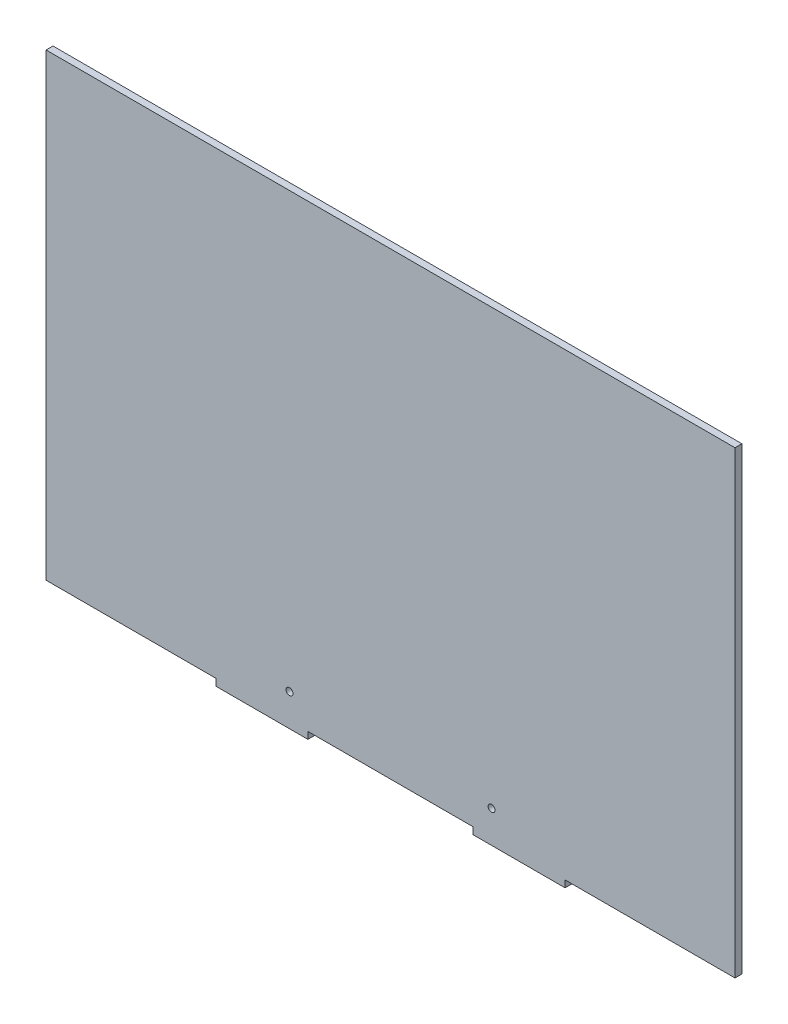
ISO-10303-21;
HEADER;
FILE_DESCRIPTION(('STEP AP214'),'2;1');
FILE_NAME('part.step','',(''),(''),'','','');
FILE_SCHEMA(('AUTOMOTIVE_DESIGN { 1 0 10303 214 1 1 1 1 }'));
ENDSEC;
DATA;
#1=APPLICATION_CONTEXT('core data for automotive mechanical design processes');
#2=APPLICATION_PROTOCOL_DEFINITION('international standard','automotive_design',2000,#1);
#3=PRODUCT_CONTEXT('',#1,'mechanical');
#4=PRODUCT('Part','Part','',(#3));
#5=PRODUCT_RELATED_PRODUCT_CATEGORY('part','',(#4));
#6=PRODUCT_DEFINITION_FORMATION('','',#4);
#7=PRODUCT_DEFINITION_CONTEXT('part definition',#1,'design');
#8=PRODUCT_DEFINITION('design','',#6,#7);
#9=PRODUCT_DEFINITION_SHAPE('','',#8);
#10=(LENGTH_UNIT() NAMED_UNIT(*) SI_UNIT(.MILLI.,.METRE.));
#11=(NAMED_UNIT(*) PLANE_ANGLE_UNIT() SI_UNIT($,.RADIAN.));
#12=(NAMED_UNIT(*) SI_UNIT($,.STERADIAN.) SOLID_ANGLE_UNIT());
#13=UNCERTAINTY_MEASURE_WITH_UNIT(LENGTH_MEASURE(1.E-05),#10,'distance_accuracy_value','');
#14=(GEOMETRIC_REPRESENTATION_CONTEXT(3) GLOBAL_UNCERTAINTY_ASSIGNED_CONTEXT((#13)) GLOBAL_UNIT_ASSIGNED_CONTEXT((#10,
#11,#12)) REPRESENTATION_CONTEXT('',''));
#15=CARTESIAN_POINT('',(0.,0.,0.));
#16=DIRECTION('',(0.,0.,1.));
#17=DIRECTION('',(1.,0.,0.));
#18=AXIS2_PLACEMENT_3D('',#15,#16,#17);
#19=CARTESIAN_POINT('',(0.,-5.67035307669584,3.));
#20=DIRECTION('',(0.,1.,0.));
#21=DIRECTION('',(-1.,0.,0.));
#22=AXIS2_PLACEMENT_3D('',#19,#20,#21);
#23=PLANE('',#22);
#24=DIRECTION('',(1.,0.,0.));
#25=VECTOR('',#24,1.);
#26=CARTESIAN_POINT('',(0.,-5.67035307669584,0.));
#27=LINE('',#26,#25);
#28=CARTESIAN_POINT('',(-58.0462656038542,-5.67035307669583,0.));
#29=VERTEX_POINT('',#28);
#30=CARTESIAN_POINT('',(13.9537343961458,-5.67035307669584,0.));
#31=VERTEX_POINT('',#30);
#32=EDGE_CURVE('E156',#29,#31,#27,.T.);
#33=ORIENTED_EDGE('',*,*,#32,.T.);
#34=DIRECTION('',(0.,0.,-1.));
#35=VECTOR('',#34,1.);
#36=CARTESIAN_POINT('',(13.9537343961458,-5.67035307669584,3.));
#37=LINE('',#36,#35);
#38=CARTESIAN_POINT('',(13.9537343961458,-5.67035307669584,3.));
#39=VERTEX_POINT('',#38);
#40=EDGE_CURVE('E11',#39,#31,#37,.T.);
#41=ORIENTED_EDGE('',*,*,#40,.F.);
#42=DIRECTION('',(1.,0.,0.));
#43=VECTOR('',#42,1.);
#44=CARTESIAN_POINT('',(0.,-5.67035307669584,3.));
#45=LINE('',#44,#43);
#46=CARTESIAN_POINT('',(-58.0462656038542,-5.67035307669583,3.));
#47=VERTEX_POINT('',#46);
#48=EDGE_CURVE('E187',#47,#39,#45,.T.);
#49=ORIENTED_EDGE('',*,*,#48,.F.);
#50=DIRECTION('',(0.,0.,-1.));
#51=VECTOR('',#50,1.);
#52=CARTESIAN_POINT('',(-58.0462656038542,-5.67035307669583,3.));
#53=LINE('',#52,#51);
#54=EDGE_CURVE('E51',#47,#29,#53,.T.);
#55=ORIENTED_EDGE('',*,*,#54,.T.);
#56=EDGE_LOOP('',(#33,#41,#49,#55));
#57=FACE_BOUND('',#56,.T.);
#58=ADVANCED_FACE('F35',(#57),#23,.F.);
#59=CARTESIAN_POINT('',(13.9537343961458,0.,3.));
#60=DIRECTION('',(1.,0.,0.));
#61=DIRECTION('',(0.,0.,-1.));
#62=AXIS2_PLACEMENT_3D('',#59,#60,#61);
#63=PLANE('',#62);
#64=DIRECTION('',(0.,-1.,0.));
#65=VECTOR('',#64,1.);
#66=CARTESIAN_POINT('',(13.9537343961458,0.,0.));
#67=LINE('',#66,#65);
#68=CARTESIAN_POINT('',(13.9537343961458,-8.67035307669584,0.));
#69=VERTEX_POINT('',#68);
#70=EDGE_CURVE('E158',#31,#69,#67,.T.);
#71=ORIENTED_EDGE('',*,*,#70,.T.);
#72=DIRECTION('',(0.,0.,-1.));
#73=VECTOR('',#72,1.);
#74=CARTESIAN_POINT('',(13.9537343961458,-8.67035307669584,3.));
#75=LINE('',#74,#73);
#76=CARTESIAN_POINT('',(13.9537343961458,-8.67035307669584,3.));
#77=VERTEX_POINT('',#76);
#78=EDGE_CURVE('E43',#77,#69,#75,.T.);
#79=ORIENTED_EDGE('',*,*,#78,.F.);
#80=DIRECTION('',(0.,-1.,0.));
#81=VECTOR('',#80,1.);
#82=CARTESIAN_POINT('',(13.9537343961458,0.,3.));
#83=LINE('',#82,#81);
#84=EDGE_CURVE('E102',#39,#77,#83,.T.);
#85=ORIENTED_EDGE('',*,*,#84,.F.);
#86=ORIENTED_EDGE('',*,*,#40,.T.);
#87=EDGE_LOOP('',(#71,#79,#85,#86));
#88=FACE_BOUND('',#87,.T.);
#89=ADVANCED_FACE('F209',(#88),#63,.F.);
#90=CARTESIAN_POINT('',(0.,-8.67035307669584,3.));
#91=DIRECTION('',(0.,-1.,0.));
#92=DIRECTION('',(1.,0.,0.));
#93=AXIS2_PLACEMENT_3D('',#90,#91,#92);
#94=PLANE('',#93);
#95=DIRECTION('',(-1.,0.,0.));
#96=VECTOR('',#95,1.);
#97=CARTESIAN_POINT('',(0.,-8.67035307669584,0.));
#98=LINE('',#97,#96);
#99=CARTESIAN_POINT('',(53.9537343961458,-8.67035307669584,0.));
#100=VERTEX_POINT('',#99);
#101=EDGE_CURVE('E162',#100,#69,#98,.T.);
#102=ORIENTED_EDGE('',*,*,#101,.F.);
#103=DIRECTION('',(0.,0.,-1.));
#104=VECTOR('',#103,1.);
#105=CARTESIAN_POINT('',(53.9537343961458,-8.67035307669584,3.));
#106=LINE('',#105,#104);
#107=CARTESIAN_POINT('',(53.9537343961458,-8.67035307669584,3.));
#108=VERTEX_POINT('',#107);
#109=EDGE_CURVE('E202',#108,#100,#106,.T.);
#110=ORIENTED_EDGE('',*,*,#109,.F.);
#111=DIRECTION('',(-1.,0.,0.));
#112=VECTOR('',#111,1.);
#113=CARTESIAN_POINT('',(0.,-8.67035307669584,3.));
#114=LINE('',#113,#112);
#115=EDGE_CURVE('E208',#108,#77,#114,.T.);
#116=ORIENTED_EDGE('',*,*,#115,.T.);
#117=ORIENTED_EDGE('',*,*,#78,.T.);
#118=EDGE_LOOP('',(#102,#110,#116,#117));
#119=FACE_BOUND('',#118,.T.);
#120=ADVANCED_FACE('F206',(#119),#94,.T.);
#121=CARTESIAN_POINT('',(53.9537343961458,0.,3.));
#122=DIRECTION('',(1.,0.,0.));
#123=DIRECTION('',(0.,0.,-1.));
#124=AXIS2_PLACEMENT_3D('',#121,#122,#123);
#125=PLANE('',#124);
#126=DIRECTION('',(0.,-1.,0.));
#127=VECTOR('',#126,1.);
#128=CARTESIAN_POINT('',(53.9537343961458,0.,0.));
#129=LINE('',#128,#127);
#130=CARTESIAN_POINT('',(53.9537343961458,-5.67035307669584,0.));
#131=VERTEX_POINT('',#130);
#132=EDGE_CURVE('E165',#131,#100,#129,.T.);
#133=ORIENTED_EDGE('',*,*,#132,.F.);
#134=DIRECTION('',(0.,0.,-1.));
#135=VECTOR('',#134,1.);
#136=CARTESIAN_POINT('',(53.9537343961458,-5.67035307669584,3.));
#137=LINE('',#136,#135);
#138=CARTESIAN_POINT('',(53.9537343961458,-5.67035307669584,3.));
#139=VERTEX_POINT('',#138);
#140=EDGE_CURVE('E200',#139,#131,#137,.T.);
#141=ORIENTED_EDGE('',*,*,#140,.F.);
#142=DIRECTION('',(0.,-1.,0.));
#143=VECTOR('',#142,1.);
#144=CARTESIAN_POINT('',(53.9537343961458,0.,3.));
#145=LINE('',#144,#143);
#146=EDGE_CURVE('E220',#139,#108,#145,.T.);
#147=ORIENTED_EDGE('',*,*,#146,.T.);
#148=ORIENTED_EDGE('',*,*,#109,.T.);
#149=EDGE_LOOP('',(#133,#141,#147,#148));
#150=FACE_BOUND('',#149,.T.);
#151=ADVANCED_FACE('F216',(#150),#125,.T.);
#152=CARTESIAN_POINT('',(0.,-5.67035307669584,3.));
#153=DIRECTION('',(0.,1.,0.));
#154=DIRECTION('',(-1.,0.,0.));
#155=AXIS2_PLACEMENT_3D('',#152,#153,#154);
#156=PLANE('',#155);
#157=DIRECTION('',(1.,0.,0.));
#158=VECTOR('',#157,1.);
#159=CARTESIAN_POINT('',(0.,-5.67035307669584,0.));
#160=LINE('',#159,#158);
#161=CARTESIAN_POINT('',(127.953734396146,-5.67035307669583,0.));
#162=VERTEX_POINT('',#161);
#163=EDGE_CURVE('E168',#131,#162,#160,.T.);
#164=ORIENTED_EDGE('',*,*,#163,.T.);
#165=DIRECTION('',(0.,0.,-1.));
#166=VECTOR('',#165,1.);
#167=CARTESIAN_POINT('',(127.953734396146,-5.67035307669583,3.));
#168=LINE('',#167,#166);
#169=CARTESIAN_POINT('',(127.953734396146,-5.67035307669583,3.));
#170=VERTEX_POINT('',#169);
#171=EDGE_CURVE('E198',#170,#162,#168,.T.);
#172=ORIENTED_EDGE('',*,*,#171,.F.);
#173=DIRECTION('',(1.,0.,0.));
#174=VECTOR('',#173,1.);
#175=CARTESIAN_POINT('',(0.,-5.67035307669584,3.));
#176=LINE('',#175,#174);
#177=EDGE_CURVE('E222',#139,#170,#176,.T.);
#178=ORIENTED_EDGE('',*,*,#177,.F.);
#179=ORIENTED_EDGE('',*,*,#140,.T.);
#180=EDGE_LOOP('',(#164,#172,#178,#179));
#181=FACE_BOUND('',#180,.T.);
#182=ADVANCED_FACE('F359',(#181),#156,.F.);
#183=CARTESIAN_POINT('',(127.953734396146,0.,3.));
#184=DIRECTION('',(1.,0.,0.));
#185=DIRECTION('',(0.,1.,0.));
#186=AXIS2_PLACEMENT_3D('',#183,#184,#185);
#187=PLANE('',#186);
#188=DIRECTION('',(0.,-1.,0.));
#189=VECTOR('',#188,1.);
#190=CARTESIAN_POINT('',(127.953734396146,0.,0.));
#191=LINE('',#190,#189);
#192=CARTESIAN_POINT('',(127.953734396146,194.329646923304,0.));
#193=VERTEX_POINT('',#192);
#194=EDGE_CURVE('E171',#193,#162,#191,.T.);
#195=ORIENTED_EDGE('',*,*,#194,.F.);
#196=DIRECTION('',(0.,0.,-1.));
#197=VECTOR('',#196,1.);
#198=CARTESIAN_POINT('',(127.953734396146,194.329646923304,3.));
#199=LINE('',#198,#197);
#200=CARTESIAN_POINT('',(127.953734396146,194.329646923304,3.));
#201=VERTEX_POINT('',#200);
#202=EDGE_CURVE('E196',#201,#193,#199,.T.);
#203=ORIENTED_EDGE('',*,*,#202,.F.);
#204=DIRECTION('',(0.,-1.,0.));
#205=VECTOR('',#204,1.);
#206=CARTESIAN_POINT('',(127.953734396146,0.,3.));
#207=LINE('',#206,#205);
#208=EDGE_CURVE('E228',#201,#170,#207,.T.);
#209=ORIENTED_EDGE('',*,*,#208,.T.);
#210=ORIENTED_EDGE('',*,*,#171,.T.);
#211=EDGE_LOOP('',(#195,#203,#209,#210));
#212=FACE_BOUND('',#211,.T.);
#213=ADVANCED_FACE('F350',(#212),#187,.T.);
#214=CARTESIAN_POINT('',(0.,194.329646923304,3.));
#215=DIRECTION('',(0.,1.,0.));
#216=DIRECTION('',(0.,0.,1.));
#217=AXIS2_PLACEMENT_3D('',#214,#215,#216);
#218=PLANE('',#217);
#219=DIRECTION('',(1.,0.,0.));
#220=VECTOR('',#219,1.);
#221=CARTESIAN_POINT('',(0.,194.329646923304,0.));
#222=LINE('',#221,#220);
#223=CARTESIAN_POINT('',(-172.046265603854,194.329646923304,0.));
#224=VERTEX_POINT('',#223);
#225=EDGE_CURVE('E174',#224,#193,#222,.T.);
#226=ORIENTED_EDGE('',*,*,#225,.F.);
#227=DIRECTION('',(0.,0.,-1.));
#228=VECTOR('',#227,1.);
#229=CARTESIAN_POINT('',(-172.046265603854,194.329646923304,3.));
#230=LINE('',#229,#228);
#231=CARTESIAN_POINT('',(-172.046265603854,194.329646923304,3.));
#232=VERTEX_POINT('',#231);
#233=EDGE_CURVE('E194',#232,#224,#230,.T.);
#234=ORIENTED_EDGE('',*,*,#233,.F.);
#235=DIRECTION('',(1.,0.,0.));
#236=VECTOR('',#235,1.);
#237=CARTESIAN_POINT('',(0.,194.329646923304,3.));
#238=LINE('',#237,#236);
#239=EDGE_CURVE('E231',#232,#201,#238,.T.);
#240=ORIENTED_EDGE('',*,*,#239,.T.);
#241=ORIENTED_EDGE('',*,*,#202,.T.);
#242=EDGE_LOOP('',(#226,#234,#240,#241));
#243=FACE_BOUND('',#242,.T.);
#244=ADVANCED_FACE('F342',(#243),#218,.T.);
#245=CARTESIAN_POINT('',(-172.046265603854,0.,3.));
#246=DIRECTION('',(1.,0.,0.));
#247=DIRECTION('',(0.,1.,0.));
#248=AXIS2_PLACEMENT_3D('',#245,#246,#247);
#249=PLANE('',#248);
#250=DIRECTION('',(0.,-1.,0.));
#251=VECTOR('',#250,1.);
#252=CARTESIAN_POINT('',(-172.046265603854,0.,0.));
#253=LINE('',#252,#251);
#254=CARTESIAN_POINT('',(-172.046265603854,-5.67035307669583,0.));
#255=VERTEX_POINT('',#254);
#256=EDGE_CURVE('E177',#224,#255,#253,.T.);
#257=ORIENTED_EDGE('',*,*,#256,.T.);
#258=DIRECTION('',(0.,0.,-1.));
#259=VECTOR('',#258,1.);
#260=CARTESIAN_POINT('',(-172.046265603854,-5.67035307669583,3.));
#261=LINE('',#260,#259);
#262=CARTESIAN_POINT('',(-172.046265603854,-5.67035307669583,3.));
#263=VERTEX_POINT('',#262);
#264=EDGE_CURVE('E191',#263,#255,#261,.T.);
#265=ORIENTED_EDGE('',*,*,#264,.F.);
#266=DIRECTION('',(0.,-1.,0.));
#267=VECTOR('',#266,1.);
#268=CARTESIAN_POINT('',(-172.046265603854,0.,3.));
#269=LINE('',#268,#267);
#270=EDGE_CURVE('E234',#232,#263,#269,.T.);
#271=ORIENTED_EDGE('',*,*,#270,.F.);
#272=ORIENTED_EDGE('',*,*,#233,.T.);
#273=EDGE_LOOP('',(#257,#265,#271,#272));
#274=FACE_BOUND('',#273,.T.);
#275=ADVANCED_FACE('F240',(#274),#249,.F.);
#276=CARTESIAN_POINT('',(0.,-5.67035307669588,3.));
#277=DIRECTION('',(0.,1.,0.));
#278=DIRECTION('',(-1.,0.,0.));
#279=AXIS2_PLACEMENT_3D('',#276,#277,#278);
#280=PLANE('',#279);
#281=DIRECTION('',(1.,0.,0.));
#282=VECTOR('',#281,1.);
#283=CARTESIAN_POINT('',(0.,-5.67035307669588,0.));
#284=LINE('',#283,#282);
#285=CARTESIAN_POINT('',(-98.0462656038542,-5.67035307669585,0.));
#286=VERTEX_POINT('',#285);
#287=EDGE_CURVE('E179',#255,#286,#284,.T.);
#288=ORIENTED_EDGE('',*,*,#287,.T.);
#289=DIRECTION('',(0.,0.,-1.));
#290=VECTOR('',#289,1.);
#291=CARTESIAN_POINT('',(-98.0462656038542,-5.67035307669585,3.));
#292=LINE('',#291,#290);
#293=CARTESIAN_POINT('',(-98.0462656038542,-5.67035307669585,3.));
#294=VERTEX_POINT('',#293);
#295=EDGE_CURVE('E148',#294,#286,#292,.T.);
#296=ORIENTED_EDGE('',*,*,#295,.F.);
#297=DIRECTION('',(1.,0.,0.));
#298=VECTOR('',#297,1.);
#299=CARTESIAN_POINT('',(0.,-5.67035307669588,3.));
#300=LINE('',#299,#298);
#301=EDGE_CURVE('E136',#263,#294,#300,.T.);
#302=ORIENTED_EDGE('',*,*,#301,.F.);
#303=ORIENTED_EDGE('',*,*,#264,.T.);
#304=EDGE_LOOP('',(#288,#296,#302,#303));
#305=FACE_BOUND('',#304,.T.);
#306=ADVANCED_FACE('F244',(#305),#280,.F.);
#307=CARTESIAN_POINT('',(-98.0462656038542,0.,3.));
#308=DIRECTION('',(1.,0.,0.));
#309=DIRECTION('',(0.,0.,-1.));
#310=AXIS2_PLACEMENT_3D('',#307,#308,#309);
#311=PLANE('',#310);
#312=DIRECTION('',(0.,-1.,0.));
#313=VECTOR('',#312,1.);
#314=CARTESIAN_POINT('',(-98.0462656038542,0.,0.));
#315=LINE('',#314,#313);
#316=CARTESIAN_POINT('',(-98.0462656038542,-8.67035307669587,0.));
#317=VERTEX_POINT('',#316);
#318=EDGE_CURVE('E145',#286,#317,#315,.T.);
#319=ORIENTED_EDGE('',*,*,#318,.T.);
#320=DIRECTION('',(0.,0.,-1.));
#321=VECTOR('',#320,1.);
#322=CARTESIAN_POINT('',(-98.0462656038542,-8.67035307669587,3.));
#323=LINE('',#322,#321);
#324=CARTESIAN_POINT('',(-98.0462656038542,-8.67035307669587,3.));
#325=VERTEX_POINT('',#324);
#326=EDGE_CURVE('E142',#325,#317,#323,.T.);
#327=ORIENTED_EDGE('',*,*,#326,.F.);
#328=DIRECTION('',(0.,-1.,0.));
#329=VECTOR('',#328,1.);
#330=CARTESIAN_POINT('',(-98.0462656038542,0.,3.));
#331=LINE('',#330,#329);
#332=EDGE_CURVE('E129',#294,#325,#331,.T.);
#333=ORIENTED_EDGE('',*,*,#332,.F.);
#334=ORIENTED_EDGE('',*,*,#295,.T.);
#335=EDGE_LOOP('',(#319,#327,#333,#334));
#336=FACE_BOUND('',#335,.T.);
#337=ADVANCED_FACE('F143',(#336),#311,.F.);
#338=CARTESIAN_POINT('',(0.,-8.67035307669587,3.));
#339=DIRECTION('',(0.,1.,0.));
#340=DIRECTION('',(0.,0.,1.));
#341=AXIS2_PLACEMENT_3D('',#338,#339,#340);
#342=PLANE('',#341);
#343=DIRECTION('',(1.,0.,0.));
#344=VECTOR('',#343,1.);
#345=CARTESIAN_POINT('',(0.,-8.67035307669587,0.));
#346=LINE('',#345,#344);
#347=CARTESIAN_POINT('',(-58.0462656038542,-8.67035307669587,0.));
#348=VERTEX_POINT('',#347);
#349=EDGE_CURVE('E182',#317,#348,#346,.T.);
#350=ORIENTED_EDGE('',*,*,#349,.T.);
#351=DIRECTION('',(0.,0.,-1.));
#352=VECTOR('',#351,1.);
#353=CARTESIAN_POINT('',(-58.0462656038542,-8.67035307669587,3.));
#354=LINE('',#353,#352);
#355=CARTESIAN_POINT('',(-58.0462656038542,-8.67035307669587,3.));
#356=VERTEX_POINT('',#355);
#357=EDGE_CURVE('E90',#356,#348,#354,.T.);
#358=ORIENTED_EDGE('',*,*,#357,.F.);
#359=DIRECTION('',(1.,0.,0.));
#360=VECTOR('',#359,1.);
#361=CARTESIAN_POINT('',(0.,-8.67035307669587,3.));
#362=LINE('',#361,#360);
#363=EDGE_CURVE('E134',#325,#356,#362,.T.);
#364=ORIENTED_EDGE('',*,*,#363,.F.);
#365=ORIENTED_EDGE('',*,*,#326,.T.);
#366=EDGE_LOOP('',(#350,#358,#364,#365));
#367=FACE_BOUND('',#366,.T.);
#368=ADVANCED_FACE('F150',(#367),#342,.F.);
#369=CARTESIAN_POINT('',(-58.0462656038542,0.,3.));
#370=DIRECTION('',(1.,0.,0.));
#371=DIRECTION('',(0.,0.,-1.));
#372=AXIS2_PLACEMENT_3D('',#369,#370,#371);
#373=PLANE('',#372);
#374=DIRECTION('',(0.,-1.,0.));
#375=VECTOR('',#374,1.);
#376=CARTESIAN_POINT('',(-58.0462656038542,0.,0.));
#377=LINE('',#376,#375);
#378=EDGE_CURVE('E184',#29,#348,#377,.T.);
#379=ORIENTED_EDGE('',*,*,#378,.F.);
#380=ORIENTED_EDGE('',*,*,#54,.F.);
#381=DIRECTION('',(0.,-1.,0.));
#382=VECTOR('',#381,1.);
#383=CARTESIAN_POINT('',(-58.0462656038542,0.,3.));
#384=LINE('',#383,#382);
#385=EDGE_CURVE('E151',#47,#356,#384,.T.);
#386=ORIENTED_EDGE('',*,*,#385,.T.);
#387=ORIENTED_EDGE('',*,*,#357,.T.);
#388=EDGE_LOOP('',(#379,#380,#386,#387));
#389=FACE_BOUND('',#388,.T.);
#390=ADVANCED_FACE('F245',(#389),#373,.T.);
#391=CARTESIAN_POINT('',(0.,0.,3.));
#392=DIRECTION('',(0.,0.,1.));
#393=DIRECTION('',(1.,0.,0.));
#394=AXIS2_PLACEMENT_3D('',#391,#392,#393);
#395=PLANE('',#394);
#396=CARTESIAN_POINT('',(21.9537343961457,5.32964692330418,3.));
#397=DIRECTION('',(0.,0.,1.));
#398=DIRECTION('',(1.,0.,0.));
#399=AXIS2_PLACEMENT_3D('',#396,#397,#398);
#400=CIRCLE('',#399,1.5);
#401=CARTESIAN_POINT('',(23.4537343961457,5.32964692330418,3.));
#402=VERTEX_POINT('',#401);
#403=EDGE_CURVE('E268',#402,#402,#400,.T.);
#404=ORIENTED_EDGE('',*,*,#403,.F.);
#405=EDGE_LOOP('',(#404));
#406=FACE_BOUND('',#405,.T.);
#407=CARTESIAN_POINT('',(-66.0462656038543,5.32964692330418,3.));
#408=DIRECTION('',(0.,0.,1.));
#409=DIRECTION('',(1.,0.,0.));
#410=AXIS2_PLACEMENT_3D('',#407,#408,#409);
#411=CIRCLE('',#410,1.5);
#412=CARTESIAN_POINT('',(-64.5462656038543,5.32964692330418,3.));
#413=VERTEX_POINT('',#412);
#414=EDGE_CURVE('E262',#413,#413,#411,.T.);
#415=ORIENTED_EDGE('',*,*,#414,.F.);
#416=EDGE_LOOP('',(#415));
#417=FACE_BOUND('',#416,.T.);
#418=ORIENTED_EDGE('',*,*,#48,.T.);
#419=ORIENTED_EDGE('',*,*,#84,.T.);
#420=ORIENTED_EDGE('',*,*,#115,.F.);
#421=ORIENTED_EDGE('',*,*,#146,.F.);
#422=ORIENTED_EDGE('',*,*,#177,.T.);
#423=ORIENTED_EDGE('',*,*,#208,.F.);
#424=ORIENTED_EDGE('',*,*,#239,.F.);
#425=ORIENTED_EDGE('',*,*,#270,.T.);
#426=ORIENTED_EDGE('',*,*,#301,.T.);
#427=ORIENTED_EDGE('',*,*,#332,.T.);
#428=ORIENTED_EDGE('',*,*,#363,.T.);
#429=ORIENTED_EDGE('',*,*,#385,.F.);
#430=EDGE_LOOP('',(#418,#419,#420,#421,#422,#423,#424,#425,#426,#427,#428,#429));
#431=FACE_BOUND('',#430,.T.);
#432=ADVANCED_FACE('F131',(#406,#417,#431),#395,.T.);
#433=CARTESIAN_POINT('',(0.,0.,0.));
#434=DIRECTION('',(0.,0.,1.));
#435=DIRECTION('',(1.,0.,0.));
#436=AXIS2_PLACEMENT_3D('',#433,#434,#435);
#437=PLANE('',#436);
#438=CARTESIAN_POINT('',(21.9537343961457,5.32964692330418,0.));
#439=DIRECTION('',(0.,0.,1.));
#440=DIRECTION('',(1.,0.,0.));
#441=AXIS2_PLACEMENT_3D('',#438,#439,#440);
#442=CIRCLE('',#441,1.5);
#443=CARTESIAN_POINT('',(23.4537343961457,5.32964692330418,0.));
#444=VERTEX_POINT('',#443);
#445=EDGE_CURVE('E265',#444,#444,#442,.T.);
#446=ORIENTED_EDGE('',*,*,#445,.T.);
#447=EDGE_LOOP('',(#446));
#448=FACE_BOUND('',#447,.T.);
#449=CARTESIAN_POINT('',(-66.0462656038543,5.32964692330418,0.));
#450=DIRECTION('',(0.,0.,1.));
#451=DIRECTION('',(1.,0.,0.));
#452=AXIS2_PLACEMENT_3D('',#449,#450,#451);
#453=CIRCLE('',#452,1.5);
#454=CARTESIAN_POINT('',(-64.5462656038543,5.32964692330418,0.));
#455=VERTEX_POINT('',#454);
#456=EDGE_CURVE('E159',#455,#455,#453,.T.);
#457=ORIENTED_EDGE('',*,*,#456,.T.);
#458=EDGE_LOOP('',(#457));
#459=FACE_BOUND('',#458,.T.);
#460=ORIENTED_EDGE('',*,*,#32,.F.);
#461=ORIENTED_EDGE('',*,*,#378,.T.);
#462=ORIENTED_EDGE('',*,*,#349,.F.);
#463=ORIENTED_EDGE('',*,*,#318,.F.);
#464=ORIENTED_EDGE('',*,*,#287,.F.);
#465=ORIENTED_EDGE('',*,*,#256,.F.);
#466=ORIENTED_EDGE('',*,*,#225,.T.);
#467=ORIENTED_EDGE('',*,*,#194,.T.);
#468=ORIENTED_EDGE('',*,*,#163,.F.);
#469=ORIENTED_EDGE('',*,*,#132,.T.);
#470=ORIENTED_EDGE('',*,*,#101,.T.);
#471=ORIENTED_EDGE('',*,*,#70,.F.);
#472=EDGE_LOOP('',(#460,#461,#462,#463,#464,#465,#466,#467,#468,#469,#470,#471));
#473=FACE_BOUND('',#472,.T.);
#474=ADVANCED_FACE('F212',(#448,#459,#473),#437,.F.);
#475=CARTESIAN_POINT('',(-66.0462656038543,5.32964692330418,0.));
#476=DIRECTION('',(0.,0.,1.));
#477=DIRECTION('',(1.,0.,0.));
#478=AXIS2_PLACEMENT_3D('',#475,#476,#477);
#479=CYLINDRICAL_SURFACE('',#478,1.5);
#480=ORIENTED_EDGE('',*,*,#456,.F.);
#481=EDGE_LOOP('',(#480));
#482=FACE_BOUND('',#481,.T.);
#483=ORIENTED_EDGE('',*,*,#414,.T.);
#484=EDGE_LOOP('',(#483));
#485=FACE_BOUND('',#484,.T.);
#486=ADVANCED_FACE('F279',(#482,#485),#479,.F.);
#487=CARTESIAN_POINT('',(21.9537343961457,5.32964692330418,0.));
#488=DIRECTION('',(0.,0.,1.));
#489=DIRECTION('',(1.,0.,0.));
#490=AXIS2_PLACEMENT_3D('',#487,#488,#489);
#491=CYLINDRICAL_SURFACE('',#490,1.5);
#492=ORIENTED_EDGE('',*,*,#445,.F.);
#493=EDGE_LOOP('',(#492));
#494=FACE_BOUND('',#493,.T.);
#495=ORIENTED_EDGE('',*,*,#403,.T.);
#496=EDGE_LOOP('',(#495));
#497=FACE_BOUND('',#496,.T.);
#498=ADVANCED_FACE('F276',(#494,#497),#491,.F.);
#499=CLOSED_SHELL('',(#58,#89,#120,#151,#182,#213,#244,#275,#306,#337,#368,#390,#432,#474,#486,#498));
#500=MANIFOLD_SOLID_BREP('B2',#499);
#501=ADVANCED_BREP_SHAPE_REPRESENTATION('',(#18,#500),#14);
#502=SHAPE_DEFINITION_REPRESENTATION(#9,#501);
ENDSEC;
END-ISO-10303-21;
